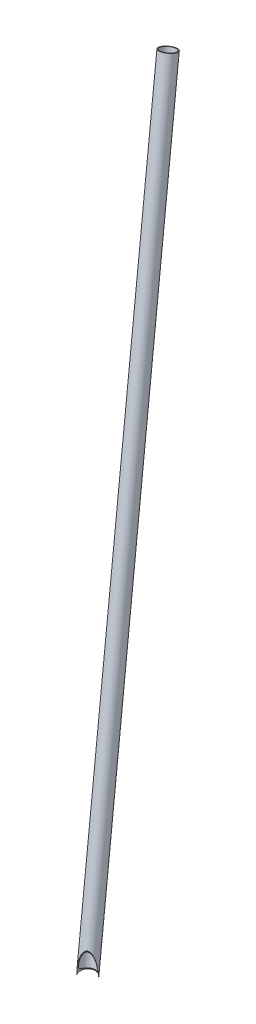
ISO-10303-21;
HEADER;
FILE_DESCRIPTION(('STEP AP214'),'2;1');
FILE_NAME('part.step','',(''),(''),'','','');
FILE_SCHEMA(('AUTOMOTIVE_DESIGN { 1 0 10303 214 1 1 1 1 }'));
ENDSEC;
DATA;
#1=APPLICATION_CONTEXT('core data for automotive mechanical design processes');
#2=APPLICATION_PROTOCOL_DEFINITION('international standard','automotive_design',2000,#1);
#3=PRODUCT_CONTEXT('',#1,'mechanical');
#4=PRODUCT('Part','Part','',(#3));
#5=PRODUCT_RELATED_PRODUCT_CATEGORY('part','',(#4));
#6=PRODUCT_DEFINITION_FORMATION('','',#4);
#7=PRODUCT_DEFINITION_CONTEXT('part definition',#1,'design');
#8=PRODUCT_DEFINITION('design','',#6,#7);
#9=PRODUCT_DEFINITION_SHAPE('','',#8);
#10=(LENGTH_UNIT() NAMED_UNIT(*) SI_UNIT(.MILLI.,.METRE.));
#11=(NAMED_UNIT(*) PLANE_ANGLE_UNIT() SI_UNIT($,.RADIAN.));
#12=(NAMED_UNIT(*) SI_UNIT($,.STERADIAN.) SOLID_ANGLE_UNIT());
#13=UNCERTAINTY_MEASURE_WITH_UNIT(LENGTH_MEASURE(1.E-05),#10,'distance_accuracy_value','');
#14=(GEOMETRIC_REPRESENTATION_CONTEXT(3) GLOBAL_UNCERTAINTY_ASSIGNED_CONTEXT((#13)) GLOBAL_UNIT_ASSIGNED_CONTEXT((#10,
#11,#12)) REPRESENTATION_CONTEXT('',''));
#15=CARTESIAN_POINT('',(0.,0.,0.));
#16=DIRECTION('',(0.,0.,1.));
#17=DIRECTION('',(1.,0.,0.));
#18=AXIS2_PLACEMENT_3D('',#15,#16,#17);
#19=CARTESIAN_POINT('',(250.,1.11022302462516E-13,-1700.));
#20=DIRECTION('',(-0.140336447675245,0.956366902675742,-0.256257739239816));
#21=DIRECTION('',(0.,0.258819045102517,0.965925826289069));
#22=AXIS2_PLACEMENT_3D('',#19,#20,#21);
#23=CYLINDRICAL_SURFACE('',#22,9.79999999999998);
#24=CARTESIAN_POINT('',(115.,920.,-1946.51325703663));
#25=DIRECTION('',(-0.140336447675245,0.956366902675742,-0.256257739239816));
#26=DIRECTION('',(0.,0.258819045102518,0.965925826289069));
#27=AXIS2_PLACEMENT_3D('',#24,#25,#26);
#28=CIRCLE('',#27,9.79999999999998);
#29=CARTESIAN_POINT('',(115.,922.536426642005,-1937.047183939));
#30=VERTEX_POINT('',#29);
#31=EDGE_CURVE('E87',#30,#30,#28,.T.);
#32=ORIENTED_EDGE('',*,*,#31,.T.);
#33=EDGE_LOOP('',(#32));
#34=FACE_BOUND('',#33,.T.);
#35=CARTESIAN_POINT('',(246.498060142901,26.4014982607513,-1696.92855356992));
#36=CARTESIAN_POINT('',(246.337548616065,26.1447479591223,-1696.85975434216));
#37=CARTESIAN_POINT('',(246.18356496424,25.8826564489811,-1696.79560606769));
#38=CARTESIAN_POINT('',(245.886833221694,25.3503375858636,-1696.67537762029));
#39=CARTESIAN_POINT('',(245.744089388824,25.080107202815,-1696.61930049826));
#40=CARTESIAN_POINT('',(245.468232165104,24.5329704215316,-1696.51422155875));
#41=CARTESIAN_POINT('',(245.335132353416,24.2560553147843,-1696.46522962446));
#42=CARTESIAN_POINT('',(245.077599848657,23.697242813779,-1696.37368957143));
#43=CARTESIAN_POINT('',(244.953166089966,23.415346037455,-1696.33114065965));
#44=CARTESIAN_POINT('',(244.711465550912,22.8463285333334,-1696.25175745832));
#45=CARTESIAN_POINT('',(244.594230249489,22.5591911250952,-1696.21494731589));
#46=CARTESIAN_POINT('',(244.366649462568,21.9815552677818,-1696.14682390657));
#47=CARTESIAN_POINT('',(244.2563041746,21.6910567226286,-1696.11551079722));
#48=CARTESIAN_POINT('',(244.04188457199,21.1075034726165,-1696.05808995768));
#49=CARTESIAN_POINT('',(243.937805561306,20.8144508752051,-1696.03197829471));
#50=CARTESIAN_POINT('',(243.735224462045,20.2260225701898,-1695.98471728364));
#51=CARTESIAN_POINT('',(243.636722609976,19.930646764671,-1695.96356814587));
#52=CARTESIAN_POINT('',(243.375047989571,19.1226986523844,-1695.91248498044));
#53=CARTESIAN_POINT('',(243.216868035112,18.608197260981,-1695.8873275822));
#54=CARTESIAN_POINT('',(242.913190219906,17.5748994434408,-1695.85130052244));
#55=CARTESIAN_POINT('',(242.767694718904,17.0561022377081,-1695.84043351415));
#56=CARTESIAN_POINT('',(242.487142447427,16.0146707363258,-1695.83372494489));
#57=CARTESIAN_POINT('',(242.352103544715,15.4920314739679,-1695.83790854714));
#58=CARTESIAN_POINT('',(242.090822704646,14.445113264525,-1695.86307875801));
#59=CARTESIAN_POINT('',(241.964577863681,13.9208349189438,-1695.88405979162));
#60=CARTESIAN_POINT('',(241.779668266133,13.1316759632894,-1695.93076056584));
#61=CARTESIAN_POINT('',(241.718500313368,12.8669262531179,-1695.94898674825));
#62=CARTESIAN_POINT('',(241.597584174188,12.3375687068572,-1695.99122957335));
#63=CARTESIAN_POINT('',(241.537835926685,12.0729608651442,-1696.01524596641));
#64=CARTESIAN_POINT('',(241.4193625676,11.5437973701862,-1696.06994874116));
#65=CARTESIAN_POINT('',(241.360639042376,11.2792423334102,-1696.1006446179));
#66=CARTESIAN_POINT('',(241.243964130938,10.7509797765074,-1696.16981504211));
#67=CARTESIAN_POINT('',(241.186012709607,10.4872722182537,-1696.20828923453));
#68=CARTESIAN_POINT('',(241.070832254388,9.96273267115725,-1696.29427798122));
#69=CARTESIAN_POINT('',(241.013600995439,9.70189284635295,-1696.34174107269));
#70=CARTESIAN_POINT('',(240.899144568601,9.18238498250026,-1696.44782333422));
#71=CARTESIAN_POINT('',(240.841919405429,8.92371747686988,-1696.50644516526));
#72=CARTESIAN_POINT('',(240.727286132623,8.41054411113874,-1696.63727562122));
#73=CARTESIAN_POINT('',(240.669878825731,8.15602953910928,-1696.70945027727));
#74=CARTESIAN_POINT('',(240.554555588151,7.65263006860154,-1696.87078567444));
#75=CARTESIAN_POINT('',(240.496640036934,7.40374139613888,-1696.95993462621));
#76=CARTESIAN_POINT('',(240.394987135291,6.97584944004519,-1697.13435804832));
#77=CARTESIAN_POINT('',(240.351331595854,6.79495486709552,-1697.21501106056));
#78=CARTESIAN_POINT('',(240.264128908667,6.43981813274966,-1697.39007287246));
#79=CARTESIAN_POINT('',(240.220581770346,6.26557653237986,-1697.48448282899));
#80=CARTESIAN_POINT('',(240.134506872452,5.92697504188198,-1697.68823494366));
#81=CARTESIAN_POINT('',(240.091975039054,5.76256917913027,-1697.79749828021));
#82=CARTESIAN_POINT('',(240.008849894769,5.44536172119241,-1698.03240301179));
#83=CARTESIAN_POINT('',(239.968255831548,5.29255560860913,-1698.15803797874));
#84=CARTESIAN_POINT('',(239.898302336274,5.0299403482953,-1698.39913373614));
#85=CARTESIAN_POINT('',(239.868310994208,4.91761238291226,-1698.51167465922));
#86=CARTESIAN_POINT('',(239.811559960373,4.70295906620215,-1698.74666356586));
#87=CARTESIAN_POINT('',(239.78479986009,4.6006324507501,-1698.86911029378));
#88=CARTESIAN_POINT('',(239.735430590444,4.40627279740497,-1699.1230856757));
#89=CARTESIAN_POINT('',(239.712829816223,4.31426072138769,-1699.25463197601));
#90=CARTESIAN_POINT('',(239.672726601969,4.1407019950207,-1699.52519513759));
#91=CARTESIAN_POINT('',(239.655225068405,4.05915720683682,-1699.66421332192));
#92=CARTESIAN_POINT('',(239.622756175429,3.88870209010037,-1699.98035363028));
#93=CARTESIAN_POINT('',(239.60925838573,3.80230042954163,-1700.15897978726));
#94=CARTESIAN_POINT('',(239.592026584838,3.64292430364952,-1700.52256172938));
#95=CARTESIAN_POINT('',(239.58829513031,3.56995335890144,-1700.70751915912));
#96=CARTESIAN_POINT('',(239.591234973197,3.43548317822181,-1701.08182395235));
#97=CARTESIAN_POINT('',(239.597925353591,3.37400521758362,-1701.27117874194));
#98=CARTESIAN_POINT('',(239.622123417288,3.26086347383422,-1701.65213176449));
#99=CARTESIAN_POINT('',(239.639634136045,3.20920245000989,-1701.84373061219));
#100=CARTESIAN_POINT('',(239.6932260741,3.09850287382574,-1702.29045446457));
#101=CARTESIAN_POINT('',(239.733508618971,3.04258029555353,-1702.54585483783));
#102=CARTESIAN_POINT('',(239.833690053055,2.94200194213362,-1703.05503739847));
#103=CARTESIAN_POINT('',(239.893594358334,2.89734928377998,-1703.30881911932));
#104=CARTESIAN_POINT('',(240.032951512999,2.8168839531251,-1703.8123768395));
#105=CARTESIAN_POINT('',(240.112404487727,2.78107133750789,-1704.06215281313));
#106=CARTESIAN_POINT('',(240.290615097912,2.71642610101793,-1704.55561366389));
#107=CARTESIAN_POINT('',(240.389371113245,2.68759289481001,-1704.79929905028));
#108=CARTESIAN_POINT('',(240.607024163214,2.63519382725619,-1705.28142606628));
#109=CARTESIAN_POINT('',(240.726135038213,2.61169079110787,-1705.51977801017));
#110=CARTESIAN_POINT('',(240.983158354249,2.56926248813185,-1705.98655080622));
#111=CARTESIAN_POINT('',(241.121071101051,2.55033729576541,-1706.21497149679));
#112=CARTESIAN_POINT('',(241.414962351068,2.51623393585619,-1706.66012259762));
#113=CARTESIAN_POINT('',(241.570937755824,2.50105512705548,-1706.87685500355));
#114=CARTESIAN_POINT('',(241.90010092917,2.47381928240906,-1707.29704469401));
#115=CARTESIAN_POINT('',(242.073288929144,2.46176228853686,-1707.50050180001));
#116=CARTESIAN_POINT('',(242.441862788797,2.43996226725689,-1707.8991216306));
#117=CARTESIAN_POINT('',(242.637794536234,2.43030929897672,-1708.09378510299));
#118=CARTESIAN_POINT('',(243.045607051498,2.41351197342397,-1708.46575140369));
#119=CARTESIAN_POINT('',(243.257488245136,2.40636768315569,-1708.64305376822));
#120=CARTESIAN_POINT('',(243.695712288574,2.39438331030632,-1708.97890096201));
#121=CARTESIAN_POINT('',(243.922055986604,2.38954336301644,-1709.13744468952));
#122=CARTESIAN_POINT('',(244.387537710182,2.38208664498742,-1709.43453460972));
#123=CARTESIAN_POINT('',(244.626675470463,2.37946982817356,-1709.57308121679));
#124=CARTESIAN_POINT('',(245.111233670131,2.3765229942858,-1709.82668017455));
#125=CARTESIAN_POINT('',(245.35644353907,2.37614978314551,-1709.94213463583));
#126=CARTESIAN_POINT('',(245.855673923153,2.37771719752067,-1710.15206359206));
#127=CARTESIAN_POINT('',(246.109694329439,2.37965779445812,-1710.24653834611));
#128=CARTESIAN_POINT('',(246.62464921408,2.386108815978,-1710.41393427662));
#129=CARTESIAN_POINT('',(246.885582309639,2.39061873024711,-1710.48685972879));
#130=CARTESIAN_POINT('',(247.412525743483,2.40259283026451,-1710.61083577751));
#131=CARTESIAN_POINT('',(247.678536112819,2.41005703408622,-1710.66188624023));
#132=CARTESIAN_POINT('',(248.214562614019,2.42850363133618,-1710.74209716916));
#133=CARTESIAN_POINT('',(248.484588651113,2.43949692397516,-1710.77118887286));
#134=CARTESIAN_POINT('',(249.025908293761,2.46572135353939,-1710.80728386273));
#135=CARTESIAN_POINT('',(249.297201915808,2.48095254575143,-1710.81428686073));
#136=CARTESIAN_POINT('',(249.839432804666,2.51663540315522,-1710.80646302754));
#137=CARTESIAN_POINT('',(250.110369339901,2.5370928538387,-1710.79161191647));
#138=CARTESIAN_POINT('',(250.649639544322,2.58449462528049,-1710.74050292312));
#139=CARTESIAN_POINT('',(250.917973262276,2.61143882425879,-1710.7042454427));
#140=CARTESIAN_POINT('',(251.455848811894,2.67417005497867,-1710.60999521784));
#141=CARTESIAN_POINT('',(251.725290371206,2.71013638599997,-1710.5515476351));
#142=CARTESIAN_POINT('',(252.257238698593,2.79298397490497,-1710.41401803668));
#143=CARTESIAN_POINT('',(252.519743769289,2.83986787730986,-1710.33493102103));
#144=CARTESIAN_POINT('',(253.034804852202,2.94758642452377,-1710.15772429805));
#145=CARTESIAN_POINT('',(253.2873773448,3.00839670966682,-1710.05963786965));
#146=CARTESIAN_POINT('',(253.780006679011,3.14801736884512,-1709.84644096762));
#147=CARTESIAN_POINT('',(254.02007234287,3.22681483774746,-1709.73134272011));
#148=CARTESIAN_POINT('',(254.39392177878,3.37217800797929,-1709.53471129994));
#149=CARTESIAN_POINT('',(254.532781053284,3.43161405447659,-1709.45749715512));
#150=CARTESIAN_POINT('',(254.803437661628,3.56017918357766,-1709.29891520171));
#151=CARTESIAN_POINT('',(254.935237495102,3.62930480348069,-1709.21754888353));
#152=CARTESIAN_POINT('',(255.190398239946,3.77812813543249,-1709.05209063686));
#153=CARTESIAN_POINT('',(255.313778646291,3.8578000752788,-1708.9680057188));
#154=CARTESIAN_POINT('',(255.551323639441,4.02859616275499,-1708.7984107152));
#155=CARTESIAN_POINT('',(255.665488387895,4.11972010943764,-1708.71290065469));
#156=CARTESIAN_POINT('',(255.884396840827,4.31438739668545,-1708.54146871255));
#157=CARTESIAN_POINT('',(255.989065580546,4.41801665012324,-1708.45554838956));
#158=CARTESIAN_POINT('',(256.187320723318,4.63676100259773,-1708.28558102468));
#159=CARTESIAN_POINT('',(256.280907647348,4.7518755612211,-1708.20153389488));
#160=CARTESIAN_POINT('',(256.456848323721,4.99266622229343,-1708.03664436984));
#161=CARTESIAN_POINT('',(256.539193479521,5.11835028984364,-1707.95580446029));
#162=CARTESIAN_POINT('',(256.692879180724,5.3787537389164,-1707.79835434276));
#163=CARTESIAN_POINT('',(256.764217799389,5.51347469647356,-1707.72174487686));
#164=CARTESIAN_POINT('',(256.918939213452,5.83702776767892,-1707.54821387374));
#165=CARTESIAN_POINT('',(256.998274295189,6.02879038383469,-1707.45315175389));
#166=CARTESIAN_POINT('',(257.140978113216,6.42199811098039,-1707.27150978795));
#167=CARTESIAN_POINT('',(257.204338597863,6.62344816228296,-1707.18493433969));
#168=CARTESIAN_POINT('',(257.317842381283,7.03387123942478,-1707.01919455998));
#169=CARTESIAN_POINT('',(257.36793495766,7.24286976064946,-1706.94005939485));
#170=CARTESIAN_POINT('',(257.456870068724,7.66551188537842,-1706.78849009246));
#171=CARTESIAN_POINT('',(257.495715071522,7.87915445873627,-1706.71605448745));
#172=CARTESIAN_POINT('',(257.584441772654,8.43769554046134,-1706.53526204542));
#173=CARTESIAN_POINT('',(257.62714968863,8.78509665102769,-1706.43115968137));
#174=CARTESIAN_POINT('',(257.694579117352,9.48453100914774,-1706.23291423856));
#175=CARTESIAN_POINT('',(257.719288712215,9.83656716911837,-1706.13877779409));
#176=CARTESIAN_POINT('',(257.754378534686,10.5438796135075,-1705.95722309354));
#177=CARTESIAN_POINT('',(257.764726362017,10.8991614099324,-1705.86982044682));
#178=CARTESIAN_POINT('',(257.77339849227,11.610852349407,-1705.6996617222));
#179=CARTESIAN_POINT('',(257.771725820124,11.9672611862753,-1705.61690448058));
#180=CARTESIAN_POINT('',(257.757869281832,12.6832492599973,-1705.45363894966));
#181=CARTESIAN_POINT('',(257.745604967654,13.0428318629644,-1705.37315275338));
#182=CARTESIAN_POINT('',(257.711469983756,13.7618927904396,-1705.21371963476));
#183=CARTESIAN_POINT('',(257.689598815227,14.1213711085631,-1705.13477279257));
#184=CARTESIAN_POINT('',(257.636896744783,14.8392300477753,-1704.97745389576));
#185=CARTESIAN_POINT('',(257.606079209766,15.1976115062574,-1704.89908116118));
#186=CARTESIAN_POINT('',(257.535780152928,15.913429584743,-1704.74190409991));
#187=CARTESIAN_POINT('',(257.496298559378,16.2708661968994,-1704.66309976965));
#188=CARTESIAN_POINT('',(257.401613759442,17.0426076173506,-1704.49134717902));
#189=CARTESIAN_POINT('',(257.344896715246,17.4566809880112,-1704.39818802717));
#190=CARTESIAN_POINT('',(257.219642379274,18.2824388286512,-1704.20917571003));
#191=CARTESIAN_POINT('',(257.151104678672,18.6941232154968,-1704.11332245167));
#192=CARTESIAN_POINT('',(257.001540943796,19.5150293321798,-1703.91774975139));
#193=CARTESIAN_POINT('',(256.920494943915,19.9242460185687,-1703.81802432265));
#194=CARTESIAN_POINT('',(256.745098994587,20.7386153587048,-1703.61381920964));
#195=CARTESIAN_POINT('',(256.650749828295,21.1437682501842,-1703.50933980548));
#196=CARTESIAN_POINT('',(256.448440479803,21.9448539546255,-1703.29555766427));
#197=CARTESIAN_POINT('',(256.340624291474,22.3408383371481,-1703.18631291719));
#198=CARTESIAN_POINT('',(256.108865814591,23.1261854520548,-1702.96076627612));
#199=CARTESIAN_POINT('',(255.984919639385,23.515546562857,-1702.84446268486));
#200=CARTESIAN_POINT('',(255.718832065132,24.2842742630735,-1702.60361165584));
#201=CARTESIAN_POINT('',(255.576736842313,24.6636633682779,-1702.47908551404));
#202=CARTESIAN_POINT('',(255.270885587118,25.4098714078397,-1702.21971474813));
#203=CARTESIAN_POINT('',(255.107144461852,25.7766987762791,-1702.08487725196));
#204=CARTESIAN_POINT('',(254.839601557483,26.3179308434317,-1701.87127903616));
#205=CARTESIAN_POINT('',(254.745477840492,26.4989886404227,-1701.79721406034));
#206=CARTESIAN_POINT('',(254.549484696083,26.8553100803322,-1701.64530736604));
#207=CARTESIAN_POINT('',(254.447614051938,27.0305728068518,-1701.56746505499));
#208=CARTESIAN_POINT('',(254.235199822222,27.3738890974578,-1701.40756184004));
#209=CARTESIAN_POINT('',(254.124654046723,27.5419408245491,-1701.32549987275));
#210=CARTESIAN_POINT('',(253.893900239815,27.8687718513761,-1701.15674020448));
#211=CARTESIAN_POINT('',(253.773694975132,28.0275537838818,-1701.07004383328));
#212=CARTESIAN_POINT('',(253.464562675038,28.4038181629922,-1700.85039791124));
#213=CARTESIAN_POINT('',(253.269468532051,28.6146848233067,-1700.71452443094));
#214=CARTESIAN_POINT('',(252.852880214497,28.9993232448018,-1700.43094412299));
#215=CARTESIAN_POINT('',(252.631442588447,29.1731723053316,-1700.28326285763));
#216=CARTESIAN_POINT('',(252.229367000707,29.4242800372467,-1700.02138352127));
#217=CARTESIAN_POINT('',(252.055455210591,29.5149322640819,-1699.9098567312));
#218=CARTESIAN_POINT('',(251.695804955819,29.6616229841439,-1699.68312548398));
#219=CARTESIAN_POINT('',(251.510082431004,29.7177070811937,-1699.56792608396));
#220=CARTESIAN_POINT('',(251.129789302792,29.7897312030013,-1699.33610570687));
#221=CARTESIAN_POINT('',(250.935165289365,29.805383700936,-1699.21948044211));
#222=CARTESIAN_POINT('',(250.545072702942,29.7938983840547,-1698.9897857161));
#223=CARTESIAN_POINT('',(250.349603966866,29.766751901424,-1698.87671697985));
#224=CARTESIAN_POINT('',(249.98209850058,29.6775748346175,-1698.66776590406));
#225=CARTESIAN_POINT('',(249.809555379598,29.6189670502404,-1698.57125796891));
#226=CARTESIAN_POINT('',(249.472291274008,29.4744903351598,-1698.3854953042));
#227=CARTESIAN_POINT('',(249.307574793593,29.3886059201957,-1698.2962447307));
#228=CARTESIAN_POINT('',(248.876646700457,29.1279692686726,-1698.06625949));
#229=CARTESIAN_POINT('',(248.61898679739,28.9328260251516,-1697.9325851931));
#230=CARTESIAN_POINT('',(248.252729147244,28.6095398715221,-1697.74720698824));
#231=CARTESIAN_POINT('',(248.1338165276,28.496447693043,-1697.68784186171));
#232=CARTESIAN_POINT('',(247.902233111342,28.2618179527729,-1697.57371027777));
#233=CARTESIAN_POINT('',(247.78956116141,28.1402819608771,-1697.51894296967));
#234=CARTESIAN_POINT('',(247.570994195563,27.8914262856962,-1697.41408321238));
#235=CARTESIAN_POINT('',(247.465049850035,27.7641643289827,-1697.36395508682));
#236=CARTESIAN_POINT('',(247.258424793131,27.5040703498078,-1697.26747420549));
#237=CARTESIAN_POINT('',(247.157744152021,27.3712382530309,-1697.22112150011));
#238=CARTESIAN_POINT('',(246.961355112531,27.1011333879823,-1697.13192507198));
#239=CARTESIAN_POINT('',(246.865639839233,26.9638672111425,-1697.08907644744));
#240=CARTESIAN_POINT('',(246.6786299759,26.6854508625122,-1697.00652349322));
#241=CARTESIAN_POINT('',(246.587335362014,26.5443007116837,-1696.96681914657));
#242=CARTESIAN_POINT('',(246.498060142901,26.4014982607513,-1696.92855356992));
#243=B_SPLINE_CURVE_WITH_KNOTS('',3,(#35,#36,#37,#38,#39,#40,#41,#42,#43,#44,#45,#46,#47,#48,
#49,#50,#51,#52,#53,#54,#55,#56,#57,#58,#59,#60,#61,#62,#63,#64,#65,#66,#67,#68,#69,#70,#71,#72,
#73,#74,#75,#76,#77,#78,#79,#80,#81,#82,#83,#84,#85,#86,#87,#88,#89,#90,#91,#92,#93,#94,#95,#96,
#97,#98,#99,#100,#101,#102,#103,#104,#105,#106,#107,#108,#109,#110,#111,#112,#113,#114,#115,
#116,#117,#118,#119,#120,#121,#122,#123,#124,#125,#126,#127,#128,#129,#130,#131,#132,#133,#134,
#135,#136,#137,#138,#139,#140,#141,#142,#143,#144,#145,#146,#147,#148,#149,#150,#151,#152,#153,
#154,#155,#156,#157,#158,#159,#160,#161,#162,#163,#164,#165,#166,#167,#168,#169,#170,#171,#172,
#173,#174,#175,#176,#177,#178,#179,#180,#181,#182,#183,#184,#185,#186,#187,#188,#189,#190,#191,
#192,#193,#194,#195,#196,#197,#198,#199,#200,#201,#202,#203,#204,#205,#206,#207,#208,#209,#210,
#211,#212,#213,#214,#215,#216,#217,#218,#219,#220,#221,#222,#223,#224,#225,#226,#227,#228,#229,
#230,#231,#232,#233,#234,#235,#236,#237,#238,#239,#240,#241,#242),.UNSPECIFIED.,.T.,.F.,(4,2,2,
2,2,2,2,2,2,2,2,2,2,2,2,2,2,2,2,2,2,2,2,2,2,2,2,2,2,2,2,2,2,2,2,2,2,2,2,2,2,2,2,2,2,2,2,2,2,2,2,
2,2,2,2,2,2,2,2,2,2,2,2,2,2,2,2,2,2,2,2,2,2,2,2,2,2,2,2,2,2,2,2,2,2,2,2,2,2,2,2,2,2,2,2,2,2,2,2,
2,2,2,2,4),(0.,0.931467186680063,1.86328554944153,2.79639143042252,3.72938236881412,
4.66619886613555,5.6030422087885,6.53917449618107,7.47534645188481,9.09148901309347,
10.7079315936445,12.3270779698647,13.9456871798848,14.7626394811304,15.5795565662176,
16.397642592541,17.2156912839362,18.0291908466346,18.8428846450652,19.6545655802936,
20.4656848126053,21.0736605074905,21.6816873585266,22.2866051733192,22.8912861878132,
23.3761035479462,23.8608595499175,24.3465834973822,24.8323937373663,25.4281336803663,
26.0240295625983,26.6210178477079,27.2181736833792,28.0106981311131,28.8034415187776,
29.5961899895311,30.3888719525846,31.1904606489496,31.9920623827355,32.7935268133053,
33.5950020191892,34.42307223812,35.2511645723059,36.0793055189668,36.9074293018607,
37.719557577131,38.5316758218511,39.3436328212735,40.1555947880737,40.9700889345494,
41.7845937072547,42.6000040773243,43.4153991403487,44.2484986438826,45.0818001561932,
45.9136550639675,46.7449150123621,47.2534236695902,47.7617510654461,48.2688584281061,
48.7759568938461,49.2867620852504,49.7975432532726,50.3087128519238,50.8199718315609,
51.5035923944629,52.1875653598442,52.8741165570963,53.5605169866084,54.6551015444954,
55.7504102421755,56.848185971609,57.9456854580044,59.051594975588,60.157561921292,
61.2618848561262,62.366216933966,63.650633231214,64.9350939597918,66.2216265489283,
67.5080834316796,68.7818045864909,70.0558332250826,71.3266826492394,72.5966613797847,
73.2477243341388,73.898889756182,74.5502200889024,75.2013645243108,76.1521826340345,
77.100995360249,77.7753556267961,78.4488243322082,79.127069347277,79.8054517407904,
80.4217004019528,81.0382995192344,82.0811438305027,82.6044831032193,83.1277253344178,
83.64653439601,84.1653503816402,84.6834277281357,85.2015022790793),.UNSPECIFIED.);
#244=CARTESIAN_POINT('',(246.498060142901,26.4014982607513,-1696.92855356992));
#245=VERTEX_POINT('',#244);
#246=EDGE_CURVE('E81',#245,#245,#243,.T.);
#247=ORIENTED_EDGE('',*,*,#246,.T.);
#248=EDGE_LOOP('',(#247));
#249=FACE_BOUND('',#248,.T.);
#250=ADVANCED_FACE('F41',(#34,#249),#23,.F.);
#251=CARTESIAN_POINT('',(115.,920.,-1946.51325703663));
#252=DIRECTION('',(-0.140336447675245,0.956366902675742,-0.256257739239816));
#253=DIRECTION('',(0.,0.258819045102518,0.965925826289069));
#254=AXIS2_PLACEMENT_3D('',#251,#252,#253);
#255=PLANE('',#254);
#256=ORIENTED_EDGE('',*,*,#31,.F.);
#257=EDGE_LOOP('',(#256));
#258=FACE_BOUND('',#257,.T.);
#259=CARTESIAN_POINT('',(115.,920.,-1946.51325703663));
#260=DIRECTION('',(-0.140336447675245,0.956366902675742,-0.256257739239816));
#261=DIRECTION('',(0.,0.258819045102518,0.965925826289069));
#262=AXIS2_PLACEMENT_3D('',#259,#260,#261);
#263=CIRCLE('',#262,11.);
#264=CARTESIAN_POINT('',(115.,922.847009496128,-1935.88807294745));
#265=VERTEX_POINT('',#264);
#266=EDGE_CURVE('E57',#265,#265,#263,.T.);
#267=ORIENTED_EDGE('',*,*,#266,.T.);
#268=EDGE_LOOP('',(#267));
#269=FACE_BOUND('',#268,.T.);
#270=ADVANCED_FACE('F43',(#258,#269),#255,.T.);
#271=CARTESIAN_POINT('',(250.,1.11022302462516E-13,-1700.));
#272=DIRECTION('',(-0.140336447675245,0.956366902675742,-0.256257739239816));
#273=DIRECTION('',(0.,0.258819045102517,0.965925826289069));
#274=AXIS2_PLACEMENT_3D('',#271,#272,#273);
#275=CYLINDRICAL_SURFACE('',#274,11.);
#276=ORIENTED_EDGE('',*,*,#266,.F.);
#277=EDGE_LOOP('',(#276));
#278=FACE_BOUND('',#277,.T.);
#279=CARTESIAN_POINT('',(250.,8.16716449652246E-13,-1700.));
#280=DIRECTION('',(-0.508456010272344,0.0599232902931692,-0.859000398660194));
#281=DIRECTION('',(0.0394871934442316,0.998148808069163,0.0462570913915509));
#282=AXIS2_PLACEMENT_3D('',#279,#280,#281);
#283=ELLIPSE('',#282,31.5376862377806,11.);
#284=CARTESIAN_POINT('',(259.462003112861,-0.114398006522159,-1705.60869059481));
#285=VERTEX_POINT('',#284);
#286=CARTESIAN_POINT('',(240.537996887139,0.114398006523792,-1694.39130940519));
#287=VERTEX_POINT('',#286);
#288=EDGE_CURVE('E11',#285,#287,#283,.F.);
#289=ORIENTED_EDGE('',*,*,#288,.F.);
#290=CARTESIAN_POINT('',(250.,8.16716449652246E-13,-1700.));
#291=DIRECTION('',(0.0394871934442316,0.998148808069163,0.0462570913915509));
#292=DIRECTION('',(-0.508456010272344,0.0599232902931692,-0.859000398660194));
#293=AXIS2_PLACEMENT_3D('',#290,#291,#292);
#294=ELLIPSE('',#293,11.7370734990693,11.);
#295=EDGE_CURVE('E49',#287,#285,#294,.F.);
#296=ORIENTED_EDGE('',*,*,#295,.F.);
#297=EDGE_LOOP('',(#289,#296));
#298=FACE_BOUND('',#297,.T.);
#299=ADVANCED_FACE('F58',(#278,#298),#275,.T.);
#300=CARTESIAN_POINT('',(325.,320.,-1580.));
#301=DIRECTION('',(-0.214351342090107,-0.914565726251124,-0.342962147344171));
#302=DIRECTION('',(0.,0.351123441588391,-0.936329177569045));
#303=AXIS2_PLACEMENT_3D('',#300,#301,#302);
#304=CYLINDRICAL_SURFACE('',#303,11.);
#305=ORIENTED_EDGE('',*,*,#246,.F.);
#306=EDGE_LOOP('',(#305));
#307=FACE_BOUND('',#306,.T.);
#308=ORIENTED_EDGE('',*,*,#288,.T.);
#309=ORIENTED_EDGE('',*,*,#295,.T.);
#310=EDGE_LOOP('',(#308,#309));
#311=FACE_BOUND('',#310,.T.);
#312=ADVANCED_FACE('F55',(#307,#311),#304,.F.);
#313=CLOSED_SHELL('',(#250,#270,#299,#312));
#314=MANIFOLD_SOLID_BREP('B2',#313);
#315=ADVANCED_BREP_SHAPE_REPRESENTATION('',(#18,#314),#14);
#316=SHAPE_DEFINITION_REPRESENTATION(#9,#315);
ENDSEC;
END-ISO-10303-21;
